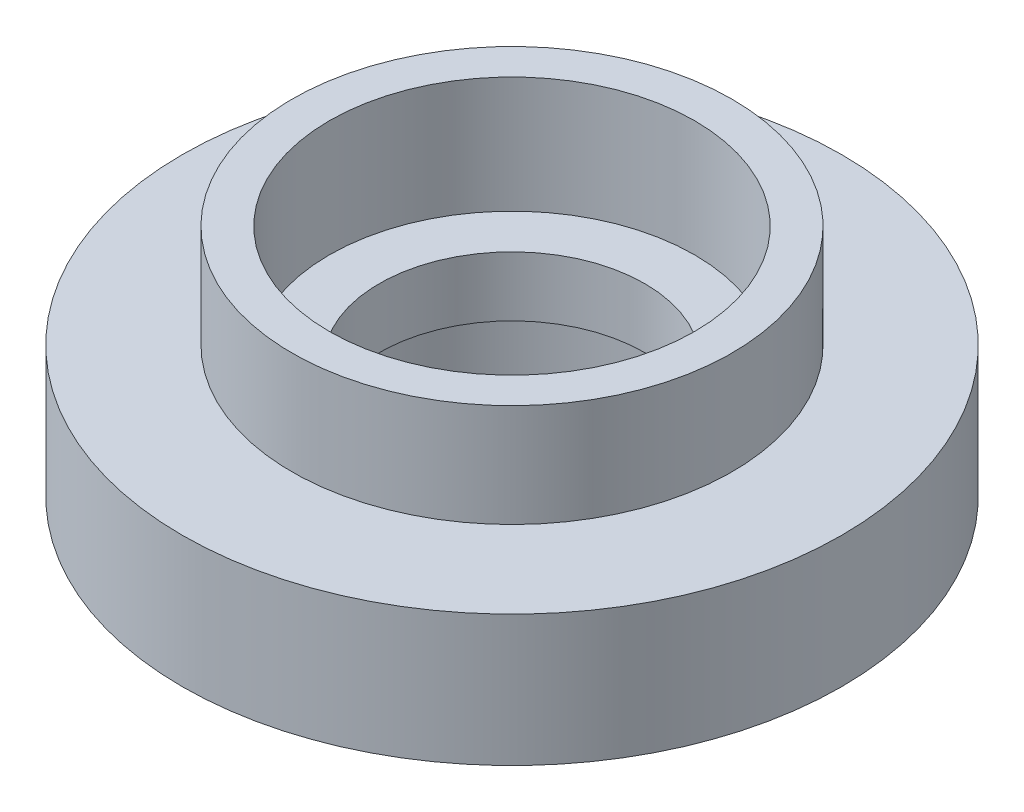
ISO-10303-21;
HEADER;
FILE_DESCRIPTION(('STEP AP214'),'2;1');
FILE_NAME('part.step','',(''),(''),'','','');
FILE_SCHEMA(('AUTOMOTIVE_DESIGN { 1 0 10303 214 1 1 1 1 }'));
ENDSEC;
DATA;
#1=APPLICATION_CONTEXT('core data for automotive mechanical design processes');
#2=APPLICATION_PROTOCOL_DEFINITION('international standard','automotive_design',2000,#1);
#3=PRODUCT_CONTEXT('',#1,'mechanical');
#4=PRODUCT('Part','Part','',(#3));
#5=PRODUCT_RELATED_PRODUCT_CATEGORY('part','',(#4));
#6=PRODUCT_DEFINITION_FORMATION('','',#4);
#7=PRODUCT_DEFINITION_CONTEXT('part definition',#1,'design');
#8=PRODUCT_DEFINITION('design','',#6,#7);
#9=PRODUCT_DEFINITION_SHAPE('','',#8);
#10=(LENGTH_UNIT() NAMED_UNIT(*) SI_UNIT(.MILLI.,.METRE.));
#11=(NAMED_UNIT(*) PLANE_ANGLE_UNIT() SI_UNIT($,.RADIAN.));
#12=(NAMED_UNIT(*) SI_UNIT($,.STERADIAN.) SOLID_ANGLE_UNIT());
#13=UNCERTAINTY_MEASURE_WITH_UNIT(LENGTH_MEASURE(1.E-05),#10,'distance_accuracy_value','');
#14=(GEOMETRIC_REPRESENTATION_CONTEXT(3) GLOBAL_UNCERTAINTY_ASSIGNED_CONTEXT((#13)) GLOBAL_UNIT_ASSIGNED_CONTEXT((#10,
#11,#12)) REPRESENTATION_CONTEXT('',''));
#15=CARTESIAN_POINT('',(0.,0.,0.));
#16=DIRECTION('',(0.,0.,1.));
#17=DIRECTION('',(1.,0.,0.));
#18=AXIS2_PLACEMENT_3D('',#15,#16,#17);
#19=CARTESIAN_POINT('',(0.,0.,0.));
#20=DIRECTION('',(0.,1.,0.));
#21=DIRECTION('',(0.,0.,1.));
#22=AXIS2_PLACEMENT_3D('',#19,#20,#21);
#23=CYLINDRICAL_SURFACE('',#22,8.);
#24=CARTESIAN_POINT('',(0.,3.5,0.));
#25=DIRECTION('',(0.,-1.,0.));
#26=DIRECTION('',(0.,0.,-1.));
#27=AXIS2_PLACEMENT_3D('',#24,#25,#26);
#28=CIRCLE('',#27,8.);
#29=CARTESIAN_POINT('',(0.,3.5,-8.));
#30=VERTEX_POINT('',#29);
#31=EDGE_CURVE('E48',#30,#30,#28,.F.);
#32=ORIENTED_EDGE('',*,*,#31,.F.);
#33=EDGE_LOOP('',(#32));
#34=FACE_BOUND('',#33,.T.);
#35=CARTESIAN_POINT('',(0.,7.1,0.));
#36=DIRECTION('',(0.,1.,0.));
#37=DIRECTION('',(0.,0.,1.));
#38=AXIS2_PLACEMENT_3D('',#35,#36,#37);
#39=CIRCLE('',#38,8.);
#40=CARTESIAN_POINT('',(0.,7.1,8.));
#41=VERTEX_POINT('',#40);
#42=EDGE_CURVE('E36',#41,#41,#39,.F.);
#43=ORIENTED_EDGE('',*,*,#42,.F.);
#44=EDGE_LOOP('',(#43));
#45=FACE_BOUND('',#44,.T.);
#46=ADVANCED_FACE('F32',(#34,#45),#23,.F.);
#47=CARTESIAN_POINT('',(0.,7.9,0.));
#48=DIRECTION('',(0.,-1.,0.));
#49=DIRECTION('',(0.,0.,-1.));
#50=AXIS2_PLACEMENT_3D('',#47,#48,#49);
#51=CYLINDRICAL_SURFACE('',#50,19.86);
#52=CARTESIAN_POINT('',(0.,7.9,0.));
#53=DIRECTION('',(0.,1.,0.));
#54=DIRECTION('',(0.,0.,1.));
#55=AXIS2_PLACEMENT_3D('',#52,#53,#54);
#56=CIRCLE('',#55,19.86);
#57=CARTESIAN_POINT('',(0.,7.9,19.86));
#58=VERTEX_POINT('',#57);
#59=EDGE_CURVE('E40',#58,#58,#56,.T.);
#60=ORIENTED_EDGE('',*,*,#59,.F.);
#61=EDGE_LOOP('',(#60));
#62=FACE_BOUND('',#61,.T.);
#63=CARTESIAN_POINT('',(0.,0.,0.));
#64=DIRECTION('',(0.,1.,0.));
#65=DIRECTION('',(0.,0.,1.));
#66=AXIS2_PLACEMENT_3D('',#63,#64,#65);
#67=CIRCLE('',#66,19.86);
#68=CARTESIAN_POINT('',(0.,0.,19.86));
#69=VERTEX_POINT('',#68);
#70=EDGE_CURVE('E45',#69,#69,#67,.T.);
#71=ORIENTED_EDGE('',*,*,#70,.T.);
#72=EDGE_LOOP('',(#71));
#73=FACE_BOUND('',#72,.T.);
#74=ADVANCED_FACE('F34',(#62,#73),#51,.T.);
#75=CARTESIAN_POINT('',(0.,7.9,0.));
#76=DIRECTION('',(0.,1.,0.));
#77=DIRECTION('',(0.,0.,1.));
#78=AXIS2_PLACEMENT_3D('',#75,#76,#77);
#79=PLANE('',#78);
#80=CARTESIAN_POINT('',(0.,7.9,0.));
#81=DIRECTION('',(0.,1.,0.));
#82=DIRECTION('',(0.,0.,1.));
#83=AXIS2_PLACEMENT_3D('',#80,#81,#82);
#84=CIRCLE('',#83,13.25);
#85=CARTESIAN_POINT('',(0.,7.9,-13.25));
#86=VERTEX_POINT('',#85);
#87=EDGE_CURVE('E70',#86,#86,#84,.T.);
#88=ORIENTED_EDGE('',*,*,#87,.F.);
#89=EDGE_LOOP('',(#88));
#90=FACE_BOUND('',#89,.T.);
#91=ORIENTED_EDGE('',*,*,#59,.T.);
#92=EDGE_LOOP('',(#91));
#93=FACE_BOUND('',#92,.T.);
#94=ADVANCED_FACE('F79',(#90,#93),#79,.T.);
#95=CARTESIAN_POINT('',(0.,0.,0.));
#96=DIRECTION('',(0.,1.,0.));
#97=DIRECTION('',(0.,0.,1.));
#98=AXIS2_PLACEMENT_3D('',#95,#96,#97);
#99=PLANE('',#98);
#100=CARTESIAN_POINT('',(0.,0.,0.));
#101=DIRECTION('',(0.,1.,0.));
#102=DIRECTION('',(0.,0.,1.));
#103=AXIS2_PLACEMENT_3D('',#100,#101,#102);
#104=CIRCLE('',#103,13.25);
#105=CARTESIAN_POINT('',(0.,0.,13.25));
#106=VERTEX_POINT('',#105);
#107=EDGE_CURVE('E10',#106,#106,#104,.F.);
#108=ORIENTED_EDGE('',*,*,#107,.F.);
#109=EDGE_LOOP('',(#108));
#110=FACE_BOUND('',#109,.T.);
#111=ORIENTED_EDGE('',*,*,#70,.F.);
#112=EDGE_LOOP('',(#111));
#113=FACE_BOUND('',#112,.T.);
#114=ADVANCED_FACE('F82',(#110,#113),#99,.F.);
#115=CARTESIAN_POINT('',(0.,14.1,0.));
#116=DIRECTION('',(0.,1.,0.));
#117=DIRECTION('',(0.,0.,1.));
#118=AXIS2_PLACEMENT_3D('',#115,#116,#117);
#119=PLANE('',#118);
#120=CARTESIAN_POINT('',(0.,14.1,0.));
#121=DIRECTION('',(0.,1.,0.));
#122=DIRECTION('',(0.,0.,1.));
#123=AXIS2_PLACEMENT_3D('',#120,#121,#122);
#124=CIRCLE('',#123,13.25);
#125=CARTESIAN_POINT('',(0.,14.1,-13.25));
#126=VERTEX_POINT('',#125);
#127=EDGE_CURVE('E71',#126,#126,#124,.T.);
#128=ORIENTED_EDGE('',*,*,#127,.T.);
#129=EDGE_LOOP('',(#128));
#130=FACE_BOUND('',#129,.T.);
#131=CARTESIAN_POINT('',(0.,14.1,0.));
#132=DIRECTION('',(0.,1.,0.));
#133=DIRECTION('',(0.,0.,1.));
#134=AXIS2_PLACEMENT_3D('',#131,#132,#133);
#135=CIRCLE('',#134,11.);
#136=CARTESIAN_POINT('',(0.,14.1,-11.));
#137=VERTEX_POINT('',#136);
#138=EDGE_CURVE('E67',#137,#137,#135,.T.);
#139=ORIENTED_EDGE('',*,*,#138,.F.);
#140=EDGE_LOOP('',(#139));
#141=FACE_BOUND('',#140,.T.);
#142=ADVANCED_FACE('F92',(#130,#141),#119,.T.);
#143=CARTESIAN_POINT('',(0.,14.1,0.));
#144=DIRECTION('',(0.,-1.,0.));
#145=DIRECTION('',(0.,0.,-1.));
#146=AXIS2_PLACEMENT_3D('',#143,#144,#145);
#147=CYLINDRICAL_SURFACE('',#146,13.25);
#148=CARTESIAN_POINT('',(0.,14.1,-13.25));
#149=CARTESIAN_POINT('',(0.,14.0354166666667,-13.25));
#150=CARTESIAN_POINT('',(0.,13.9708333333333,-13.25));
#151=CARTESIAN_POINT('',(0.,13.8416666666667,-13.25));
#152=CARTESIAN_POINT('',(0.,13.7770833333333,-13.25));
#153=CARTESIAN_POINT('',(0.,13.6479166666667,-13.25));
#154=CARTESIAN_POINT('',(0.,13.5833333333333,-13.25));
#155=CARTESIAN_POINT('',(0.,13.4541666666667,-13.25));
#156=CARTESIAN_POINT('',(0.,13.3895833333333,-13.25));
#157=CARTESIAN_POINT('',(0.,13.2604166666667,-13.25));
#158=CARTESIAN_POINT('',(0.,13.1958333333333,-13.25));
#159=CARTESIAN_POINT('',(0.,13.0666666666667,-13.25));
#160=CARTESIAN_POINT('',(0.,13.0020833333333,-13.25));
#161=CARTESIAN_POINT('',(0.,12.8729166666667,-13.25));
#162=CARTESIAN_POINT('',(0.,12.8083333333333,-13.25));
#163=CARTESIAN_POINT('',(0.,12.6791666666667,-13.25));
#164=CARTESIAN_POINT('',(0.,12.6145833333333,-13.25));
#165=CARTESIAN_POINT('',(0.,12.4854166666667,-13.25));
#166=CARTESIAN_POINT('',(0.,12.4208333333333,-13.25));
#167=CARTESIAN_POINT('',(0.,12.2916666666667,-13.25));
#168=CARTESIAN_POINT('',(0.,12.2270833333333,-13.25));
#169=CARTESIAN_POINT('',(0.,12.0979166666667,-13.25));
#170=CARTESIAN_POINT('',(0.,12.0333333333333,-13.25));
#171=CARTESIAN_POINT('',(0.,11.9041666666667,-13.25));
#172=CARTESIAN_POINT('',(0.,11.8395833333333,-13.25));
#173=CARTESIAN_POINT('',(0.,11.7104166666667,-13.25));
#174=CARTESIAN_POINT('',(0.,11.6458333333333,-13.25));
#175=CARTESIAN_POINT('',(0.,11.5166666666667,-13.25));
#176=CARTESIAN_POINT('',(0.,11.4520833333333,-13.25));
#177=CARTESIAN_POINT('',(0.,11.3229166666667,-13.25));
#178=CARTESIAN_POINT('',(0.,11.2583333333333,-13.25));
#179=CARTESIAN_POINT('',(0.,11.1291666666667,-13.25));
#180=CARTESIAN_POINT('',(0.,11.0645833333333,-13.25));
#181=CARTESIAN_POINT('',(0.,10.9354166666667,-13.25));
#182=CARTESIAN_POINT('',(0.,10.8708333333333,-13.25));
#183=CARTESIAN_POINT('',(0.,10.7416666666667,-13.25));
#184=CARTESIAN_POINT('',(0.,10.6770833333333,-13.25));
#185=CARTESIAN_POINT('',(0.,10.5479166666667,-13.25));
#186=CARTESIAN_POINT('',(0.,10.4833333333333,-13.25));
#187=CARTESIAN_POINT('',(0.,10.3541666666667,-13.25));
#188=CARTESIAN_POINT('',(0.,10.2895833333333,-13.25));
#189=CARTESIAN_POINT('',(0.,10.1604166666667,-13.25));
#190=CARTESIAN_POINT('',(0.,10.0958333333333,-13.25));
#191=CARTESIAN_POINT('',(0.,9.96666666666667,-13.25));
#192=CARTESIAN_POINT('',(0.,9.90208333333333,-13.25));
#193=CARTESIAN_POINT('',(0.,9.77291666666667,-13.25));
#194=CARTESIAN_POINT('',(0.,9.70833333333333,-13.25));
#195=CARTESIAN_POINT('',(0.,9.57916666666667,-13.25));
#196=CARTESIAN_POINT('',(0.,9.51458333333333,-13.25));
#197=CARTESIAN_POINT('',(0.,9.38541666666667,-13.25));
#198=CARTESIAN_POINT('',(0.,9.32083333333333,-13.25));
#199=CARTESIAN_POINT('',(0.,9.19166666666667,-13.25));
#200=CARTESIAN_POINT('',(0.,9.12708333333333,-13.25));
#201=CARTESIAN_POINT('',(0.,8.99791666666667,-13.25));
#202=CARTESIAN_POINT('',(0.,8.93333333333333,-13.25));
#203=CARTESIAN_POINT('',(0.,8.80416666666667,-13.25));
#204=CARTESIAN_POINT('',(0.,8.73958333333333,-13.25));
#205=CARTESIAN_POINT('',(0.,8.61041666666667,-13.25));
#206=CARTESIAN_POINT('',(0.,8.54583333333333,-13.25));
#207=CARTESIAN_POINT('',(0.,8.41666666666667,-13.25));
#208=CARTESIAN_POINT('',(0.,8.35208333333333,-13.25));
#209=CARTESIAN_POINT('',(0.,8.22291666666667,-13.25));
#210=CARTESIAN_POINT('',(0.,8.15833333333333,-13.25));
#211=CARTESIAN_POINT('',(0.,8.02916666666667,-13.25));
#212=CARTESIAN_POINT('',(0.,7.96458333333333,-13.25));
#213=CARTESIAN_POINT('',(0.,7.9,-13.25));
#214=B_SPLINE_CURVE_WITH_KNOTS('',3,(#148,#149,#150,#151,#152,#153,#154,#155,#156,#157,#158,
#159,#160,#161,#162,#163,#164,#165,#166,#167,#168,#169,#170,#171,#172,#173,#174,#175,#176,#177,
#178,#179,#180,#181,#182,#183,#184,#185,#186,#187,#188,#189,#190,#191,#192,#193,#194,#195,#196,
#197,#198,#199,#200,#201,#202,#203,#204,#205,#206,#207,#208,#209,#210,#211,#212,#213),
.UNSPECIFIED.,.F.,.F.,(4,2,2,2,2,2,2,2,2,2,2,2,2,2,2,2,2,2,2,2,2,2,2,2,2,2,2,2,2,2,2,2,4),(0.,
0.193750000000001,0.387500000000001,0.58125,0.775000000000001,0.968750000000001,1.1625,1.35625,
1.55,1.74375,1.9375,2.13125,2.325,2.51875,2.7125,2.90625,3.1,3.29375,3.4875,3.68125,3.875,
4.06875,4.2625,4.45625,4.65,4.84375,5.0375,5.23125,5.425,5.61875,5.8125,6.00625,6.2),.UNSPECIFIED.);
#215=EDGE_CURVE('BSEAM77',#126,#86,#214,.T.);
#216=ORIENTED_EDGE('',*,*,#127,.F.);
#217=ORIENTED_EDGE('',*,*,#87,.T.);
#218=ORIENTED_EDGE('',*,*,#215,.T.);
#219=ORIENTED_EDGE('',*,*,#215,.F.);
#220=EDGE_LOOP('',(#216,#218,#217,#219));
#221=FACE_BOUND('',#220,.T.);
#222=ADVANCED_FACE('F77',(#221),#147,.T.);
#223=CARTESIAN_POINT('',(0.,14.1,0.));
#224=DIRECTION('',(0.,-1.,0.));
#225=DIRECTION('',(0.,0.,-1.));
#226=AXIS2_PLACEMENT_3D('',#223,#224,#225);
#227=CYLINDRICAL_SURFACE('',#226,11.);
#228=CARTESIAN_POINT('',(0.,7.1,0.));
#229=DIRECTION('',(0.,1.,0.));
#230=DIRECTION('',(0.,0.,1.));
#231=AXIS2_PLACEMENT_3D('',#228,#229,#230);
#232=CIRCLE('',#231,11.);
#233=CARTESIAN_POINT('',(0.,7.1,-11.));
#234=VERTEX_POINT('',#233);
#235=EDGE_CURVE('E62',#234,#234,#232,.T.);
#236=CARTESIAN_POINT('',(0.,14.1,-11.));
#237=CARTESIAN_POINT('',(0.,14.0270833333333,-11.));
#238=CARTESIAN_POINT('',(0.,13.9541666666667,-11.));
#239=CARTESIAN_POINT('',(0.,13.8083333333333,-11.));
#240=CARTESIAN_POINT('',(0.,13.7354166666667,-11.));
#241=CARTESIAN_POINT('',(0.,13.5895833333333,-11.));
#242=CARTESIAN_POINT('',(0.,13.5166666666667,-11.));
#243=CARTESIAN_POINT('',(0.,13.3708333333333,-11.));
#244=CARTESIAN_POINT('',(0.,13.2979166666667,-11.));
#245=CARTESIAN_POINT('',(0.,13.1520833333333,-11.));
#246=CARTESIAN_POINT('',(0.,13.0791666666667,-11.));
#247=CARTESIAN_POINT('',(0.,12.9333333333333,-11.));
#248=CARTESIAN_POINT('',(0.,12.8604166666667,-11.));
#249=CARTESIAN_POINT('',(0.,12.7145833333333,-11.));
#250=CARTESIAN_POINT('',(0.,12.6416666666667,-11.));
#251=CARTESIAN_POINT('',(0.,12.4958333333333,-11.));
#252=CARTESIAN_POINT('',(0.,12.4229166666667,-11.));
#253=CARTESIAN_POINT('',(0.,12.2770833333333,-11.));
#254=CARTESIAN_POINT('',(0.,12.2041666666667,-11.));
#255=CARTESIAN_POINT('',(0.,12.0583333333333,-11.));
#256=CARTESIAN_POINT('',(0.,11.9854166666667,-11.));
#257=CARTESIAN_POINT('',(0.,11.8395833333333,-11.));
#258=CARTESIAN_POINT('',(0.,11.7666666666667,-11.));
#259=CARTESIAN_POINT('',(0.,11.6208333333333,-11.));
#260=CARTESIAN_POINT('',(0.,11.5479166666667,-11.));
#261=CARTESIAN_POINT('',(0.,11.4020833333333,-11.));
#262=CARTESIAN_POINT('',(0.,11.3291666666667,-11.));
#263=CARTESIAN_POINT('',(0.,11.1833333333333,-11.));
#264=CARTESIAN_POINT('',(0.,11.1104166666667,-11.));
#265=CARTESIAN_POINT('',(0.,10.9645833333333,-11.));
#266=CARTESIAN_POINT('',(0.,10.8916666666667,-11.));
#267=CARTESIAN_POINT('',(0.,10.7458333333333,-11.));
#268=CARTESIAN_POINT('',(0.,10.6729166666667,-11.));
#269=CARTESIAN_POINT('',(0.,10.5270833333333,-11.));
#270=CARTESIAN_POINT('',(0.,10.4541666666667,-11.));
#271=CARTESIAN_POINT('',(0.,10.3083333333333,-11.));
#272=CARTESIAN_POINT('',(0.,10.2354166666667,-11.));
#273=CARTESIAN_POINT('',(0.,10.0895833333333,-11.));
#274=CARTESIAN_POINT('',(0.,10.0166666666667,-11.));
#275=CARTESIAN_POINT('',(0.,9.87083333333333,-11.));
#276=CARTESIAN_POINT('',(0.,9.79791666666667,-11.));
#277=CARTESIAN_POINT('',(0.,9.65208333333333,-11.));
#278=CARTESIAN_POINT('',(0.,9.57916666666667,-11.));
#279=CARTESIAN_POINT('',(0.,9.43333333333333,-11.));
#280=CARTESIAN_POINT('',(0.,9.36041666666667,-11.));
#281=CARTESIAN_POINT('',(0.,9.21458333333333,-11.));
#282=CARTESIAN_POINT('',(0.,9.14166666666667,-11.));
#283=CARTESIAN_POINT('',(0.,8.99583333333333,-11.));
#284=CARTESIAN_POINT('',(0.,8.92291666666667,-11.));
#285=CARTESIAN_POINT('',(0.,8.77708333333333,-11.));
#286=CARTESIAN_POINT('',(0.,8.70416666666667,-11.));
#287=CARTESIAN_POINT('',(0.,8.55833333333333,-11.));
#288=CARTESIAN_POINT('',(0.,8.48541666666667,-11.));
#289=CARTESIAN_POINT('',(0.,8.33958333333333,-11.));
#290=CARTESIAN_POINT('',(0.,8.26666666666667,-11.));
#291=CARTESIAN_POINT('',(0.,8.12083333333333,-11.));
#292=CARTESIAN_POINT('',(0.,8.04791666666667,-11.));
#293=CARTESIAN_POINT('',(0.,7.90208333333333,-11.));
#294=CARTESIAN_POINT('',(0.,7.82916666666667,-11.));
#295=CARTESIAN_POINT('',(0.,7.68333333333333,-11.));
#296=CARTESIAN_POINT('',(0.,7.61041666666667,-11.));
#297=CARTESIAN_POINT('',(0.,7.46458333333334,-11.));
#298=CARTESIAN_POINT('',(0.,7.39166666666667,-11.));
#299=CARTESIAN_POINT('',(0.,7.24583333333334,-11.));
#300=CARTESIAN_POINT('',(0.,7.17291666666667,-11.));
#301=CARTESIAN_POINT('',(0.,7.1,-11.));
#302=B_SPLINE_CURVE_WITH_KNOTS('',3,(#236,#237,#238,#239,#240,#241,#242,#243,#244,#245,#246,
#247,#248,#249,#250,#251,#252,#253,#254,#255,#256,#257,#258,#259,#260,#261,#262,#263,#264,#265,
#266,#267,#268,#269,#270,#271,#272,#273,#274,#275,#276,#277,#278,#279,#280,#281,#282,#283,#284,
#285,#286,#287,#288,#289,#290,#291,#292,#293,#294,#295,#296,#297,#298,#299,#300,#301),
.UNSPECIFIED.,.F.,.F.,(4,2,2,2,2,2,2,2,2,2,2,2,2,2,2,2,2,2,2,2,2,2,2,2,2,2,2,2,2,2,2,2,4),(0.,
0.21875,0.4375,0.656250000000001,0.875000000000001,1.09375,1.3125,1.53125,1.75,1.96875,2.1875,
2.40625,2.625,2.84375,3.0625,3.28125,3.5,3.71875,3.9375,4.15625,4.375,4.59375,4.8125,5.03125,
5.25,5.46875,5.6875,5.90625,6.125,6.34375,6.5625,6.78125,7.),.UNSPECIFIED.);
#303=EDGE_CURVE('BSEAM107',#137,#234,#302,.T.);
#304=ORIENTED_EDGE('',*,*,#138,.T.);
#305=ORIENTED_EDGE('',*,*,#235,.F.);
#306=ORIENTED_EDGE('',*,*,#303,.T.);
#307=ORIENTED_EDGE('',*,*,#303,.F.);
#308=EDGE_LOOP('',(#304,#306,#305,#307));
#309=FACE_BOUND('',#308,.T.);
#310=ADVANCED_FACE('F107',(#309),#227,.F.);
#311=CARTESIAN_POINT('',(0.,-3.5,0.));
#312=DIRECTION('',(0.,-1.,0.));
#313=DIRECTION('',(0.,0.,-1.));
#314=AXIS2_PLACEMENT_3D('',#311,#312,#313);
#315=PLANE('',#314);
#316=CARTESIAN_POINT('',(0.,-3.5,0.));
#317=DIRECTION('',(0.,-1.,0.));
#318=DIRECTION('',(0.,0.,-1.));
#319=AXIS2_PLACEMENT_3D('',#316,#317,#318);
#320=CIRCLE('',#319,13.25);
#321=CARTESIAN_POINT('',(0.,-3.5,-13.25));
#322=VERTEX_POINT('',#321);
#323=EDGE_CURVE('E55',#322,#322,#320,.T.);
#324=ORIENTED_EDGE('',*,*,#323,.T.);
#325=EDGE_LOOP('',(#324));
#326=FACE_BOUND('',#325,.T.);
#327=CARTESIAN_POINT('',(0.,-3.5,0.));
#328=DIRECTION('',(0.,-1.,0.));
#329=DIRECTION('',(0.,0.,-1.));
#330=AXIS2_PLACEMENT_3D('',#327,#328,#329);
#331=CIRCLE('',#330,11.);
#332=CARTESIAN_POINT('',(0.,-3.5,-11.));
#333=VERTEX_POINT('',#332);
#334=EDGE_CURVE('E50',#333,#333,#331,.T.);
#335=ORIENTED_EDGE('',*,*,#334,.F.);
#336=EDGE_LOOP('',(#335));
#337=FACE_BOUND('',#336,.T.);
#338=ADVANCED_FACE('F112',(#326,#337),#315,.T.);
#339=CARTESIAN_POINT('',(0.,-3.5,0.));
#340=DIRECTION('',(0.,1.,0.));
#341=DIRECTION('',(0.,0.,1.));
#342=AXIS2_PLACEMENT_3D('',#339,#340,#341);
#343=CYLINDRICAL_SURFACE('',#342,13.25);
#344=ORIENTED_EDGE('',*,*,#323,.F.);
#345=EDGE_LOOP('',(#344));
#346=FACE_BOUND('',#345,.T.);
#347=ORIENTED_EDGE('',*,*,#107,.T.);
#348=EDGE_LOOP('',(#347));
#349=FACE_BOUND('',#348,.T.);
#350=ADVANCED_FACE('F114',(#346,#349),#343,.T.);
#351=CARTESIAN_POINT('',(0.,-3.5,0.));
#352=DIRECTION('',(0.,1.,0.));
#353=DIRECTION('',(0.,0.,1.));
#354=AXIS2_PLACEMENT_3D('',#351,#352,#353);
#355=CYLINDRICAL_SURFACE('',#354,11.);
#356=ORIENTED_EDGE('',*,*,#334,.T.);
#357=EDGE_LOOP('',(#356));
#358=FACE_BOUND('',#357,.T.);
#359=CARTESIAN_POINT('',(0.,3.5,0.));
#360=DIRECTION('',(0.,-1.,0.));
#361=DIRECTION('',(0.,0.,-1.));
#362=AXIS2_PLACEMENT_3D('',#359,#360,#361);
#363=CIRCLE('',#362,11.);
#364=CARTESIAN_POINT('',(0.,3.5,-11.));
#365=VERTEX_POINT('',#364);
#366=EDGE_CURVE('E51',#365,#365,#363,.T.);
#367=ORIENTED_EDGE('',*,*,#366,.F.);
#368=EDGE_LOOP('',(#367));
#369=FACE_BOUND('',#368,.T.);
#370=ADVANCED_FACE('F117',(#358,#369),#355,.F.);
#371=CARTESIAN_POINT('',(0.,3.5,0.));
#372=DIRECTION('',(0.,-1.,0.));
#373=DIRECTION('',(0.,0.,-1.));
#374=AXIS2_PLACEMENT_3D('',#371,#372,#373);
#375=PLANE('',#374);
#376=ORIENTED_EDGE('',*,*,#366,.T.);
#377=EDGE_LOOP('',(#376));
#378=FACE_BOUND('',#377,.T.);
#379=ORIENTED_EDGE('',*,*,#31,.T.);
#380=EDGE_LOOP('',(#379));
#381=FACE_BOUND('',#380,.T.);
#382=ADVANCED_FACE('F124',(#378,#381),#375,.T.);
#383=CARTESIAN_POINT('',(0.,7.1,0.));
#384=DIRECTION('',(0.,1.,0.));
#385=DIRECTION('',(0.,0.,1.));
#386=AXIS2_PLACEMENT_3D('',#383,#384,#385);
#387=PLANE('',#386);
#388=ORIENTED_EDGE('',*,*,#235,.T.);
#389=EDGE_LOOP('',(#388));
#390=FACE_BOUND('',#389,.T.);
#391=ORIENTED_EDGE('',*,*,#42,.T.);
#392=EDGE_LOOP('',(#391));
#393=FACE_BOUND('',#392,.T.);
#394=ADVANCED_FACE('F128',(#390,#393),#387,.T.);
#395=CLOSED_SHELL('',(#46,#74,#94,#114,#142,#222,#310,#338,#350,#370,#382,#394));
#396=MANIFOLD_SOLID_BREP('B2',#395);
#397=ADVANCED_BREP_SHAPE_REPRESENTATION('',(#18,#396),#14);
#398=SHAPE_DEFINITION_REPRESENTATION(#9,#397);
ENDSEC;
END-ISO-10303-21;
